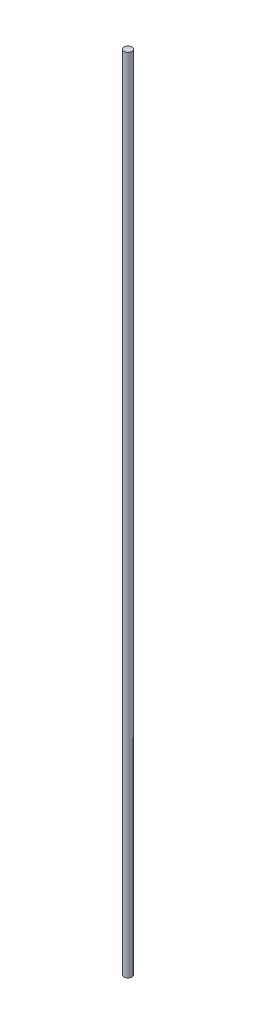
ISO-10303-21;
HEADER;
FILE_DESCRIPTION(('STEP AP214'),'2;1');
FILE_NAME('part.step','',(''),(''),'','','');
FILE_SCHEMA(('AUTOMOTIVE_DESIGN { 1 0 10303 214 1 1 1 1 }'));
ENDSEC;
DATA;
#1=APPLICATION_CONTEXT('core data for automotive mechanical design processes');
#2=APPLICATION_PROTOCOL_DEFINITION('international standard','automotive_design',2000,#1);
#3=PRODUCT_CONTEXT('',#1,'mechanical');
#4=PRODUCT('Part','Part','',(#3));
#5=PRODUCT_RELATED_PRODUCT_CATEGORY('part','',(#4));
#6=PRODUCT_DEFINITION_FORMATION('','',#4);
#7=PRODUCT_DEFINITION_CONTEXT('part definition',#1,'design');
#8=PRODUCT_DEFINITION('design','',#6,#7);
#9=PRODUCT_DEFINITION_SHAPE('','',#8);
#10=(LENGTH_UNIT() NAMED_UNIT(*) SI_UNIT(.MILLI.,.METRE.));
#11=(NAMED_UNIT(*) PLANE_ANGLE_UNIT() SI_UNIT($,.RADIAN.));
#12=(NAMED_UNIT(*) SI_UNIT($,.STERADIAN.) SOLID_ANGLE_UNIT());
#13=UNCERTAINTY_MEASURE_WITH_UNIT(LENGTH_MEASURE(1.E-05),#10,'distance_accuracy_value','');
#14=(GEOMETRIC_REPRESENTATION_CONTEXT(3) GLOBAL_UNCERTAINTY_ASSIGNED_CONTEXT((#13)) GLOBAL_UNIT_ASSIGNED_CONTEXT((#10,
#11,#12)) REPRESENTATION_CONTEXT('',''));
#15=CARTESIAN_POINT('',(0.,0.,0.));
#16=DIRECTION('',(0.,0.,1.));
#17=DIRECTION('',(1.,0.,0.));
#18=AXIS2_PLACEMENT_3D('',#15,#16,#17);
#19=CARTESIAN_POINT('',(0.,429.,0.));
#20=DIRECTION('',(0.,-1.,0.));
#21=DIRECTION('',(0.,0.,-1.));
#22=AXIS2_PLACEMENT_3D('',#19,#20,#21);
#23=CYLINDRICAL_SURFACE('',#22,2.1);
#24=CARTESIAN_POINT('',(0.,429.,0.));
#25=DIRECTION('',(0.,1.,0.));
#26=DIRECTION('',(0.,0.,1.));
#27=AXIS2_PLACEMENT_3D('',#24,#25,#26);
#28=CIRCLE('',#27,2.1);
#29=CARTESIAN_POINT('',(0.,429.,2.1));
#30=VERTEX_POINT('',#29);
#31=EDGE_CURVE('E10',#30,#30,#28,.T.);
#32=ORIENTED_EDGE('',*,*,#31,.F.);
#33=EDGE_LOOP('',(#32));
#34=FACE_BOUND('',#33,.T.);
#35=CARTESIAN_POINT('',(0.,0.,0.));
#36=DIRECTION('',(0.,1.,0.));
#37=DIRECTION('',(0.,0.,1.));
#38=AXIS2_PLACEMENT_3D('',#35,#36,#37);
#39=CIRCLE('',#38,2.1);
#40=CARTESIAN_POINT('',(0.,0.,2.1));
#41=VERTEX_POINT('',#40);
#42=EDGE_CURVE('E34',#41,#41,#39,.T.);
#43=ORIENTED_EDGE('',*,*,#42,.T.);
#44=EDGE_LOOP('',(#43));
#45=FACE_BOUND('',#44,.T.);
#46=ADVANCED_FACE('F31',(#34,#45),#23,.T.);
#47=CARTESIAN_POINT('',(0.,429.,0.));
#48=DIRECTION('',(0.,1.,0.));
#49=DIRECTION('',(0.,0.,1.));
#50=AXIS2_PLACEMENT_3D('',#47,#48,#49);
#51=PLANE('',#50);
#52=ORIENTED_EDGE('',*,*,#31,.T.);
#53=EDGE_LOOP('',(#52));
#54=FACE_BOUND('',#53,.T.);
#55=ADVANCED_FACE('F46',(#54),#51,.T.);
#56=CARTESIAN_POINT('',(0.,0.,0.));
#57=DIRECTION('',(0.,1.,0.));
#58=DIRECTION('',(0.,0.,1.));
#59=AXIS2_PLACEMENT_3D('',#56,#57,#58);
#60=PLANE('',#59);
#61=ORIENTED_EDGE('',*,*,#42,.F.);
#62=EDGE_LOOP('',(#61));
#63=FACE_BOUND('',#62,.T.);
#64=ADVANCED_FACE('F44',(#63),#60,.F.);
#65=CLOSED_SHELL('',(#46,#55,#64));
#66=MANIFOLD_SOLID_BREP('B2',#65);
#67=ADVANCED_BREP_SHAPE_REPRESENTATION('',(#18,#66),#14);
#68=SHAPE_DEFINITION_REPRESENTATION(#9,#67);
ENDSEC;
END-ISO-10303-21;
